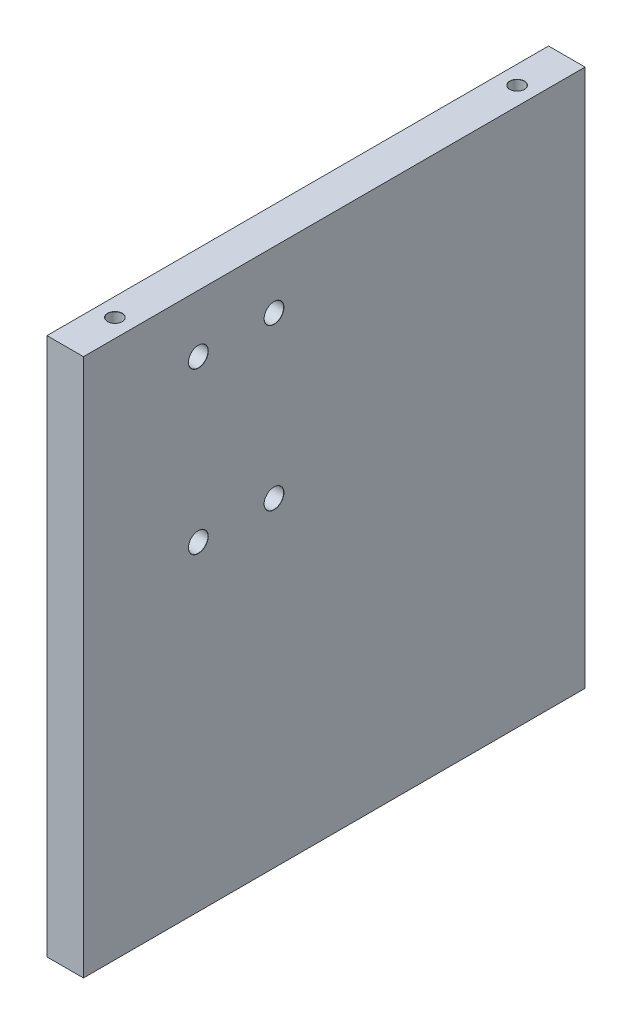
ISO-10303-21;
HEADER;
FILE_DESCRIPTION(('STEP AP214'),'2;1');
FILE_NAME('part.step','',(''),(''),'','','');
FILE_SCHEMA(('AUTOMOTIVE_DESIGN { 1 0 10303 214 1 1 1 1 }'));
ENDSEC;
DATA;
#1=APPLICATION_CONTEXT('core data for automotive mechanical design processes');
#2=APPLICATION_PROTOCOL_DEFINITION('international standard','automotive_design',2000,#1);
#3=PRODUCT_CONTEXT('',#1,'mechanical');
#4=PRODUCT('Part','Part','',(#3));
#5=PRODUCT_RELATED_PRODUCT_CATEGORY('part','',(#4));
#6=PRODUCT_DEFINITION_FORMATION('','',#4);
#7=PRODUCT_DEFINITION_CONTEXT('part definition',#1,'design');
#8=PRODUCT_DEFINITION('design','',#6,#7);
#9=PRODUCT_DEFINITION_SHAPE('','',#8);
#10=(LENGTH_UNIT() NAMED_UNIT(*) SI_UNIT(.MILLI.,.METRE.));
#11=(NAMED_UNIT(*) PLANE_ANGLE_UNIT() SI_UNIT($,.RADIAN.));
#12=(NAMED_UNIT(*) SI_UNIT($,.STERADIAN.) SOLID_ANGLE_UNIT());
#13=UNCERTAINTY_MEASURE_WITH_UNIT(LENGTH_MEASURE(1.E-05),#10,'distance_accuracy_value','');
#14=(GEOMETRIC_REPRESENTATION_CONTEXT(3) GLOBAL_UNCERTAINTY_ASSIGNED_CONTEXT((#13)) GLOBAL_UNIT_ASSIGNED_CONTEXT((#10,
#11,#12)) REPRESENTATION_CONTEXT('',''));
#15=CARTESIAN_POINT('',(0.,0.,0.));
#16=DIRECTION('',(0.,0.,1.));
#17=DIRECTION('',(1.,0.,0.));
#18=AXIS2_PLACEMENT_3D('',#15,#16,#17);
#19=CARTESIAN_POINT('',(0.,0.,0.));
#20=DIRECTION('',(-1.,0.,0.));
#21=DIRECTION('',(0.,0.,1.));
#22=AXIS2_PLACEMENT_3D('',#19,#20,#21);
#23=PLANE('',#22);
#24=CARTESIAN_POINT('',(0.,36.825,23.65));
#25=DIRECTION('',(1.,0.,0.));
#26=DIRECTION('',(0.,0.,-1.));
#27=AXIS2_PLACEMENT_3D('',#24,#25,#26);
#28=CIRCLE('',#27,1.7);
#29=CARTESIAN_POINT('',(0.,36.825,21.95));
#30=VERTEX_POINT('',#29);
#31=EDGE_CURVE('E299',#30,#30,#28,.T.);
#32=ORIENTED_EDGE('',*,*,#31,.T.);
#33=EDGE_LOOP('',(#32));
#34=FACE_BOUND('',#33,.T.);
#35=CARTESIAN_POINT('',(0.,36.825,10.48));
#36=DIRECTION('',(1.,0.,0.));
#37=DIRECTION('',(0.,0.,-1.));
#38=AXIS2_PLACEMENT_3D('',#35,#36,#37);
#39=CIRCLE('',#38,1.7);
#40=CARTESIAN_POINT('',(0.,36.825,8.78));
#41=VERTEX_POINT('',#40);
#42=EDGE_CURVE('E312',#41,#41,#39,.T.);
#43=ORIENTED_EDGE('',*,*,#42,.T.);
#44=EDGE_LOOP('',(#43));
#45=FACE_BOUND('',#44,.T.);
#46=DIRECTION('',(0.,1.,0.));
#47=VECTOR('',#46,1.);
#48=CARTESIAN_POINT('',(0.,-46.825,-43.65));
#49=LINE('',#48,#47);
#50=CARTESIAN_POINT('',(0.,-46.825,-43.65));
#51=VERTEX_POINT('',#50);
#52=CARTESIAN_POINT('',(0.,46.825,-43.65));
#53=VERTEX_POINT('',#52);
#54=EDGE_CURVE('E156',#51,#53,#49,.T.);
#55=ORIENTED_EDGE('',*,*,#54,.F.);
#56=DIRECTION('',(0.,0.,-1.));
#57=VECTOR('',#56,1.);
#58=CARTESIAN_POINT('',(0.,-46.825,43.65));
#59=LINE('',#58,#57);
#60=CARTESIAN_POINT('',(0.,-46.825,43.65));
#61=VERTEX_POINT('',#60);
#62=EDGE_CURVE('E81',#61,#51,#59,.T.);
#63=ORIENTED_EDGE('',*,*,#62,.F.);
#64=DIRECTION('',(0.,-1.,0.));
#65=VECTOR('',#64,1.);
#66=CARTESIAN_POINT('',(0.,-46.825,43.65));
#67=LINE('',#66,#65);
#68=CARTESIAN_POINT('',(0.,46.825,43.65));
#69=VERTEX_POINT('',#68);
#70=EDGE_CURVE('E75',#69,#61,#67,.T.);
#71=ORIENTED_EDGE('',*,*,#70,.F.);
#72=DIRECTION('',(0.,0.,1.));
#73=VECTOR('',#72,1.);
#74=CARTESIAN_POINT('',(0.,46.825,43.65));
#75=LINE('',#74,#73);
#76=EDGE_CURVE('E171',#53,#69,#75,.T.);
#77=ORIENTED_EDGE('',*,*,#76,.F.);
#78=EDGE_LOOP('',(#55,#63,#71,#77));
#79=FACE_BOUND('',#78,.T.);
#80=CARTESIAN_POINT('',(0.,8.885,23.65));
#81=DIRECTION('',(1.,0.,0.));
#82=DIRECTION('',(0.,0.,-1.));
#83=AXIS2_PLACEMENT_3D('',#80,#81,#82);
#84=CIRCLE('',#83,1.7);
#85=CARTESIAN_POINT('',(0.,8.885,21.95));
#86=VERTEX_POINT('',#85);
#87=EDGE_CURVE('E336',#86,#86,#84,.T.);
#88=ORIENTED_EDGE('',*,*,#87,.T.);
#89=EDGE_LOOP('',(#88));
#90=FACE_BOUND('',#89,.T.);
#91=CARTESIAN_POINT('',(0.,8.885,10.48));
#92=DIRECTION('',(1.,0.,0.));
#93=DIRECTION('',(0.,0.,-1.));
#94=AXIS2_PLACEMENT_3D('',#91,#92,#93);
#95=CIRCLE('',#94,1.7);
#96=CARTESIAN_POINT('',(0.,8.885,8.78));
#97=VERTEX_POINT('',#96);
#98=EDGE_CURVE('E324',#97,#97,#95,.T.);
#99=ORIENTED_EDGE('',*,*,#98,.T.);
#100=EDGE_LOOP('',(#99));
#101=FACE_BOUND('',#100,.T.);
#102=ADVANCED_FACE('F39',(#34,#45,#79,#90,#101),#23,.T.);
#103=CARTESIAN_POINT('',(6.35,-46.825,-43.65));
#104=DIRECTION('',(0.,0.,1.));
#105=DIRECTION('',(1.,0.,0.));
#106=AXIS2_PLACEMENT_3D('',#103,#104,#105);
#107=PLANE('',#106);
#108=ORIENTED_EDGE('',*,*,#54,.T.);
#109=DIRECTION('',(-1.,0.,0.));
#110=VECTOR('',#109,1.);
#111=CARTESIAN_POINT('',(6.35,46.825,-43.65));
#112=LINE('',#111,#110);
#113=CARTESIAN_POINT('',(6.35,46.825,-43.65));
#114=VERTEX_POINT('',#113);
#115=EDGE_CURVE('E11',#114,#53,#112,.T.);
#116=ORIENTED_EDGE('',*,*,#115,.F.);
#117=DIRECTION('',(0.,1.,0.));
#118=VECTOR('',#117,1.);
#119=CARTESIAN_POINT('',(6.35,-46.825,-43.65));
#120=LINE('',#119,#118);
#121=CARTESIAN_POINT('',(6.35,-46.825,-43.65));
#122=VERTEX_POINT('',#121);
#123=EDGE_CURVE('E157',#122,#114,#120,.T.);
#124=ORIENTED_EDGE('',*,*,#123,.F.);
#125=DIRECTION('',(-1.,0.,0.));
#126=VECTOR('',#125,1.);
#127=CARTESIAN_POINT('',(6.35,-46.825,-43.65));
#128=LINE('',#127,#126);
#129=EDGE_CURVE('E167',#122,#51,#128,.T.);
#130=ORIENTED_EDGE('',*,*,#129,.T.);
#131=EDGE_LOOP('',(#108,#116,#124,#130));
#132=FACE_BOUND('',#131,.T.);
#133=ADVANCED_FACE('F41',(#132),#107,.F.);
#134=CARTESIAN_POINT('',(6.35,46.825,43.65));
#135=DIRECTION('',(0.,-1.,0.));
#136=DIRECTION('',(0.,0.,-1.));
#137=AXIS2_PLACEMENT_3D('',#134,#135,#136);
#138=PLANE('',#137);
#139=CARTESIAN_POINT('',(3.175,46.825,-35.));
#140=DIRECTION('',(0.,1.,0.));
#141=DIRECTION('',(0.,0.,1.));
#142=AXIS2_PLACEMENT_3D('',#139,#140,#141);
#143=CIRCLE('',#142,1.275);
#144=CARTESIAN_POINT('',(3.175,46.825,-33.725));
#145=VERTEX_POINT('',#144);
#146=EDGE_CURVE('E132',#145,#145,#143,.T.);
#147=ORIENTED_EDGE('',*,*,#146,.F.);
#148=EDGE_LOOP('',(#147));
#149=FACE_BOUND('',#148,.T.);
#150=CARTESIAN_POINT('',(3.17500000000001,46.825,35.));
#151=DIRECTION('',(0.,1.,0.));
#152=DIRECTION('',(0.,0.,1.));
#153=AXIS2_PLACEMENT_3D('',#150,#151,#152);
#154=CIRCLE('',#153,1.275);
#155=CARTESIAN_POINT('',(3.17500000000001,46.825,36.275));
#156=VERTEX_POINT('',#155);
#157=EDGE_CURVE('E144',#156,#156,#154,.T.);
#158=ORIENTED_EDGE('',*,*,#157,.F.);
#159=EDGE_LOOP('',(#158));
#160=FACE_BOUND('',#159,.T.);
#161=ORIENTED_EDGE('',*,*,#76,.T.);
#162=DIRECTION('',(-1.,0.,0.));
#163=VECTOR('',#162,1.);
#164=CARTESIAN_POINT('',(6.35,46.825,43.65));
#165=LINE('',#164,#163);
#166=CARTESIAN_POINT('',(6.35,46.825,43.65));
#167=VERTEX_POINT('',#166);
#168=EDGE_CURVE('E49',#167,#69,#165,.T.);
#169=ORIENTED_EDGE('',*,*,#168,.F.);
#170=DIRECTION('',(0.,0.,1.));
#171=VECTOR('',#170,1.);
#172=CARTESIAN_POINT('',(6.35,46.825,43.65));
#173=LINE('',#172,#171);
#174=EDGE_CURVE('E88',#114,#167,#173,.T.);
#175=ORIENTED_EDGE('',*,*,#174,.F.);
#176=ORIENTED_EDGE('',*,*,#115,.T.);
#177=EDGE_LOOP('',(#161,#169,#175,#176));
#178=FACE_BOUND('',#177,.T.);
#179=ADVANCED_FACE('F203',(#149,#160,#178),#138,.F.);
#180=CARTESIAN_POINT('',(6.35,-46.825,43.65));
#181=DIRECTION('',(0.,0.,-1.));
#182=DIRECTION('',(-1.,0.,0.));
#183=AXIS2_PLACEMENT_3D('',#180,#181,#182);
#184=PLANE('',#183);
#185=ORIENTED_EDGE('',*,*,#70,.T.);
#186=DIRECTION('',(-1.,0.,0.));
#187=VECTOR('',#186,1.);
#188=CARTESIAN_POINT('',(6.35,-46.825,43.65));
#189=LINE('',#188,#187);
#190=CARTESIAN_POINT('',(6.35,-46.825,43.65));
#191=VERTEX_POINT('',#190);
#192=EDGE_CURVE('E180',#191,#61,#189,.T.);
#193=ORIENTED_EDGE('',*,*,#192,.F.);
#194=DIRECTION('',(0.,-1.,0.));
#195=VECTOR('',#194,1.);
#196=CARTESIAN_POINT('',(6.35,-46.825,43.65));
#197=LINE('',#196,#195);
#198=EDGE_CURVE('E162',#167,#191,#197,.T.);
#199=ORIENTED_EDGE('',*,*,#198,.F.);
#200=ORIENTED_EDGE('',*,*,#168,.T.);
#201=EDGE_LOOP('',(#185,#193,#199,#200));
#202=FACE_BOUND('',#201,.T.);
#203=ADVANCED_FACE('F184',(#202),#184,.F.);
#204=CARTESIAN_POINT('',(6.35,-46.825,43.65));
#205=DIRECTION('',(0.,1.,0.));
#206=DIRECTION('',(0.,0.,1.));
#207=AXIS2_PLACEMENT_3D('',#204,#205,#206);
#208=PLANE('',#207);
#209=CARTESIAN_POINT('',(3.17500000000001,-46.825,35.));
#210=DIRECTION('',(0.,-1.,0.));
#211=DIRECTION('',(0.,0.,-1.));
#212=AXIS2_PLACEMENT_3D('',#209,#210,#211);
#213=CIRCLE('',#212,1.275);
#214=CARTESIAN_POINT('',(3.17500000000001,-46.825,33.725));
#215=VERTEX_POINT('',#214);
#216=EDGE_CURVE('E121',#215,#215,#213,.T.);
#217=ORIENTED_EDGE('',*,*,#216,.F.);
#218=EDGE_LOOP('',(#217));
#219=FACE_BOUND('',#218,.T.);
#220=CARTESIAN_POINT('',(3.175,-46.825,-35.));
#221=DIRECTION('',(0.,-1.,0.));
#222=DIRECTION('',(0.,0.,-1.));
#223=AXIS2_PLACEMENT_3D('',#220,#221,#222);
#224=CIRCLE('',#223,1.275);
#225=CARTESIAN_POINT('',(3.175,-46.825,-36.275));
#226=VERTEX_POINT('',#225);
#227=EDGE_CURVE('E112',#226,#226,#224,.T.);
#228=ORIENTED_EDGE('',*,*,#227,.F.);
#229=EDGE_LOOP('',(#228));
#230=FACE_BOUND('',#229,.T.);
#231=ORIENTED_EDGE('',*,*,#62,.T.);
#232=ORIENTED_EDGE('',*,*,#129,.F.);
#233=DIRECTION('',(0.,0.,-1.));
#234=VECTOR('',#233,1.);
#235=CARTESIAN_POINT('',(6.35,-46.825,43.65));
#236=LINE('',#235,#234);
#237=EDGE_CURVE('E57',#191,#122,#236,.T.);
#238=ORIENTED_EDGE('',*,*,#237,.F.);
#239=ORIENTED_EDGE('',*,*,#192,.T.);
#240=EDGE_LOOP('',(#231,#232,#238,#239));
#241=FACE_BOUND('',#240,.T.);
#242=ADVANCED_FACE('F191',(#219,#230,#241),#208,.F.);
#243=CARTESIAN_POINT('',(6.35,0.,0.));
#244=DIRECTION('',(-1.,0.,0.));
#245=DIRECTION('',(0.,0.,1.));
#246=AXIS2_PLACEMENT_3D('',#243,#244,#245);
#247=PLANE('',#246);
#248=CARTESIAN_POINT('',(6.35,36.825,23.65));
#249=DIRECTION('',(1.,0.,0.));
#250=DIRECTION('',(0.,0.,-1.));
#251=AXIS2_PLACEMENT_3D('',#248,#249,#250);
#252=CIRCLE('',#251,1.725);
#253=CARTESIAN_POINT('',(6.35,36.825,21.925));
#254=VERTEX_POINT('',#253);
#255=EDGE_CURVE('E295',#254,#254,#252,.T.);
#256=ORIENTED_EDGE('',*,*,#255,.F.);
#257=EDGE_LOOP('',(#256));
#258=FACE_BOUND('',#257,.T.);
#259=CARTESIAN_POINT('',(6.35,36.825,10.48));
#260=DIRECTION('',(1.,0.,0.));
#261=DIRECTION('',(0.,0.,-1.));
#262=AXIS2_PLACEMENT_3D('',#259,#260,#261);
#263=CIRCLE('',#262,1.725);
#264=CARTESIAN_POINT('',(6.35,36.825,8.755));
#265=VERTEX_POINT('',#264);
#266=EDGE_CURVE('E304',#265,#265,#263,.T.);
#267=ORIENTED_EDGE('',*,*,#266,.F.);
#268=EDGE_LOOP('',(#267));
#269=FACE_BOUND('',#268,.T.);
#270=CARTESIAN_POINT('',(6.35,8.885,10.48));
#271=DIRECTION('',(1.,0.,0.));
#272=DIRECTION('',(0.,0.,-1.));
#273=AXIS2_PLACEMENT_3D('',#270,#271,#272);
#274=CIRCLE('',#273,1.725);
#275=CARTESIAN_POINT('',(6.35,8.885,8.755));
#276=VERTEX_POINT('',#275);
#277=EDGE_CURVE('E316',#276,#276,#274,.T.);
#278=ORIENTED_EDGE('',*,*,#277,.F.);
#279=EDGE_LOOP('',(#278));
#280=FACE_BOUND('',#279,.T.);
#281=CARTESIAN_POINT('',(6.35,8.885,23.65));
#282=DIRECTION('',(1.,0.,0.));
#283=DIRECTION('',(0.,0.,-1.));
#284=AXIS2_PLACEMENT_3D('',#281,#282,#283);
#285=CIRCLE('',#284,1.725);
#286=CARTESIAN_POINT('',(6.35,8.885,21.925));
#287=VERTEX_POINT('',#286);
#288=EDGE_CURVE('E328',#287,#287,#285,.T.);
#289=ORIENTED_EDGE('',*,*,#288,.F.);
#290=EDGE_LOOP('',(#289));
#291=FACE_BOUND('',#290,.T.);
#292=ORIENTED_EDGE('',*,*,#123,.T.);
#293=ORIENTED_EDGE('',*,*,#174,.T.);
#294=ORIENTED_EDGE('',*,*,#198,.T.);
#295=ORIENTED_EDGE('',*,*,#237,.T.);
#296=EDGE_LOOP('',(#292,#293,#294,#295));
#297=FACE_BOUND('',#296,.T.);
#298=ADVANCED_FACE('F193',(#258,#269,#280,#291,#297),#247,.F.);
#299=CARTESIAN_POINT('',(3.17500000000001,36.825,35.));
#300=DIRECTION('',(0.,1.,0.));
#301=DIRECTION('',(0.,0.,1.));
#302=AXIS2_PLACEMENT_3D('',#299,#300,#301);
#303=CONICAL_SURFACE('',#302,1.24999999999999,1.02974425867665);
#304=CARTESIAN_POINT('',(3.17500000000001,36.0739242262155,35.));
#305=VERTEX_POINT('',#304);
#306=VERTEX_LOOP('',#305);
#307=FACE_BOUND('',#306,.T.);
#308=CARTESIAN_POINT('',(3.17500000000001,36.825,35.));
#309=DIRECTION('',(0.,1.,0.));
#310=DIRECTION('',(0.,0.,1.));
#311=AXIS2_PLACEMENT_3D('',#308,#309,#310);
#312=CIRCLE('',#311,1.24999999999999);
#313=CARTESIAN_POINT('',(3.17500000000001,36.825,36.25));
#314=VERTEX_POINT('',#313);
#315=EDGE_CURVE('E152',#314,#314,#312,.T.);
#316=ORIENTED_EDGE('',*,*,#315,.T.);
#317=EDGE_LOOP('',(#316));
#318=FACE_BOUND('',#317,.T.);
#319=ADVANCED_FACE('F200',(#307,#318),#303,.F.);
#320=CARTESIAN_POINT('',(3.17500000000001,46.825,35.));
#321=DIRECTION('',(0.,1.,0.));
#322=DIRECTION('',(0.,0.,1.));
#323=AXIS2_PLACEMENT_3D('',#320,#321,#322);
#324=CYLINDRICAL_SURFACE('',#323,1.24999999999999);
#325=ORIENTED_EDGE('',*,*,#315,.F.);
#326=EDGE_LOOP('',(#325));
#327=FACE_BOUND('',#326,.T.);
#328=CARTESIAN_POINT('',(3.17500000000001,46.8,35.));
#329=DIRECTION('',(0.,1.,0.));
#330=DIRECTION('',(0.,0.,1.));
#331=AXIS2_PLACEMENT_3D('',#328,#329,#330);
#332=CIRCLE('',#331,1.24999999999999);
#333=CARTESIAN_POINT('',(3.17500000000001,46.8,36.25));
#334=VERTEX_POINT('',#333);
#335=EDGE_CURVE('E148',#334,#334,#332,.T.);
#336=ORIENTED_EDGE('',*,*,#335,.T.);
#337=EDGE_LOOP('',(#336));
#338=FACE_BOUND('',#337,.T.);
#339=ADVANCED_FACE('F218',(#327,#338),#324,.F.);
#340=CARTESIAN_POINT('',(3.17500000000001,46.825,35.));
#341=DIRECTION('',(0.,1.,0.));
#342=DIRECTION('',(0.,0.,1.));
#343=AXIS2_PLACEMENT_3D('',#340,#341,#342);
#344=CONICAL_SURFACE('',#343,1.275,0.785398163398003);
#345=ORIENTED_EDGE('',*,*,#335,.F.);
#346=EDGE_LOOP('',(#345));
#347=FACE_BOUND('',#346,.T.);
#348=ORIENTED_EDGE('',*,*,#157,.T.);
#349=EDGE_LOOP('',(#348));
#350=FACE_BOUND('',#349,.T.);
#351=ADVANCED_FACE('F222',(#347,#350),#344,.F.);
#352=CARTESIAN_POINT('',(3.175,36.825,-35.));
#353=DIRECTION('',(0.,1.,0.));
#354=DIRECTION('',(0.,0.,1.));
#355=AXIS2_PLACEMENT_3D('',#352,#353,#354);
#356=CONICAL_SURFACE('',#355,1.24999999999999,1.02974425867665);
#357=CARTESIAN_POINT('',(3.175,36.0739242262155,-35.));
#358=VERTEX_POINT('',#357);
#359=VERTEX_LOOP('',#358);
#360=FACE_BOUND('',#359,.T.);
#361=CARTESIAN_POINT('',(3.175,36.825,-35.));
#362=DIRECTION('',(0.,1.,0.));
#363=DIRECTION('',(0.,0.,1.));
#364=AXIS2_PLACEMENT_3D('',#361,#362,#363);
#365=CIRCLE('',#364,1.24999999999999);
#366=CARTESIAN_POINT('',(3.175,36.825,-33.75));
#367=VERTEX_POINT('',#366);
#368=EDGE_CURVE('E140',#367,#367,#365,.T.);
#369=ORIENTED_EDGE('',*,*,#368,.T.);
#370=EDGE_LOOP('',(#369));
#371=FACE_BOUND('',#370,.T.);
#372=ADVANCED_FACE('F226',(#360,#371),#356,.F.);
#373=CARTESIAN_POINT('',(3.175,46.825,-35.));
#374=DIRECTION('',(0.,1.,0.));
#375=DIRECTION('',(0.,0.,1.));
#376=AXIS2_PLACEMENT_3D('',#373,#374,#375);
#377=CYLINDRICAL_SURFACE('',#376,1.24999999999999);
#378=ORIENTED_EDGE('',*,*,#368,.F.);
#379=EDGE_LOOP('',(#378));
#380=FACE_BOUND('',#379,.T.);
#381=CARTESIAN_POINT('',(3.175,46.8,-35.));
#382=DIRECTION('',(0.,1.,0.));
#383=DIRECTION('',(0.,0.,1.));
#384=AXIS2_PLACEMENT_3D('',#381,#382,#383);
#385=CIRCLE('',#384,1.24999999999999);
#386=CARTESIAN_POINT('',(3.175,46.8,-33.75));
#387=VERTEX_POINT('',#386);
#388=EDGE_CURVE('E136',#387,#387,#385,.T.);
#389=ORIENTED_EDGE('',*,*,#388,.T.);
#390=EDGE_LOOP('',(#389));
#391=FACE_BOUND('',#390,.T.);
#392=ADVANCED_FACE('F230',(#380,#391),#377,.F.);
#393=CARTESIAN_POINT('',(3.175,46.825,-35.));
#394=DIRECTION('',(0.,1.,0.));
#395=DIRECTION('',(0.,0.,1.));
#396=AXIS2_PLACEMENT_3D('',#393,#394,#395);
#397=CONICAL_SURFACE('',#396,1.275,0.785398163398003);
#398=ORIENTED_EDGE('',*,*,#388,.F.);
#399=EDGE_LOOP('',(#398));
#400=FACE_BOUND('',#399,.T.);
#401=ORIENTED_EDGE('',*,*,#146,.T.);
#402=EDGE_LOOP('',(#401));
#403=FACE_BOUND('',#402,.T.);
#404=ADVANCED_FACE('F234',(#400,#403),#397,.F.);
#405=CARTESIAN_POINT('',(3.175,-37.5760757737845,-35.));
#406=DIRECTION('',(0.,-1.,0.));
#407=DIRECTION('',(0.,0.,-1.));
#408=AXIS2_PLACEMENT_3D('',#405,#406,#407);
#409=CONICAL_SURFACE('',#408,1.25,1.02974425867665);
#410=CARTESIAN_POINT('',(3.175,-36.825,-35.));
#411=VERTEX_POINT('',#410);
#412=VERTEX_LOOP('',#411);
#413=FACE_BOUND('',#412,.T.);
#414=CARTESIAN_POINT('',(3.175,-37.5760757737845,-35.));
#415=DIRECTION('',(0.,-1.,0.));
#416=DIRECTION('',(0.,0.,-1.));
#417=AXIS2_PLACEMENT_3D('',#414,#415,#416);
#418=CIRCLE('',#417,1.25);
#419=CARTESIAN_POINT('',(3.175,-37.5760757737845,-36.25));
#420=VERTEX_POINT('',#419);
#421=EDGE_CURVE('E128',#420,#420,#418,.T.);
#422=ORIENTED_EDGE('',*,*,#421,.T.);
#423=EDGE_LOOP('',(#422));
#424=FACE_BOUND('',#423,.T.);
#425=ADVANCED_FACE('F238',(#413,#424),#409,.F.);
#426=CARTESIAN_POINT('',(3.175,-46.825,-35.));
#427=DIRECTION('',(0.,-1.,0.));
#428=DIRECTION('',(0.,0.,-1.));
#429=AXIS2_PLACEMENT_3D('',#426,#427,#428);
#430=CYLINDRICAL_SURFACE('',#429,1.24999999999999);
#431=ORIENTED_EDGE('',*,*,#421,.F.);
#432=EDGE_LOOP('',(#431));
#433=FACE_BOUND('',#432,.T.);
#434=CARTESIAN_POINT('',(3.175,-46.8,-35.));
#435=DIRECTION('',(0.,-1.,0.));
#436=DIRECTION('',(0.,0.,-1.));
#437=AXIS2_PLACEMENT_3D('',#434,#435,#436);
#438=CIRCLE('',#437,1.24999999999999);
#439=CARTESIAN_POINT('',(3.175,-46.8,-36.25));
#440=VERTEX_POINT('',#439);
#441=EDGE_CURVE('E118',#440,#440,#438,.T.);
#442=ORIENTED_EDGE('',*,*,#441,.T.);
#443=EDGE_LOOP('',(#442));
#444=FACE_BOUND('',#443,.T.);
#445=ADVANCED_FACE('F242',(#433,#444),#430,.F.);
#446=CARTESIAN_POINT('',(3.175,-46.825,-35.));
#447=DIRECTION('',(0.,-1.,0.));
#448=DIRECTION('',(0.,0.,-1.));
#449=AXIS2_PLACEMENT_3D('',#446,#447,#448);
#450=CONICAL_SURFACE('',#449,1.275,0.785398163398003);
#451=ORIENTED_EDGE('',*,*,#441,.F.);
#452=EDGE_LOOP('',(#451));
#453=FACE_BOUND('',#452,.T.);
#454=ORIENTED_EDGE('',*,*,#227,.T.);
#455=EDGE_LOOP('',(#454));
#456=FACE_BOUND('',#455,.T.);
#457=ADVANCED_FACE('F105',(#453,#456),#450,.F.);
#458=CARTESIAN_POINT('',(3.17500000000001,-37.5760757737845,35.));
#459=DIRECTION('',(0.,-1.,0.));
#460=DIRECTION('',(0.,0.,-1.));
#461=AXIS2_PLACEMENT_3D('',#458,#459,#460);
#462=CONICAL_SURFACE('',#461,1.25,1.02974425867665);
#463=CARTESIAN_POINT('',(3.17500000000001,-36.825,35.));
#464=VERTEX_POINT('',#463);
#465=VERTEX_LOOP('',#464);
#466=FACE_BOUND('',#465,.T.);
#467=CARTESIAN_POINT('',(3.17500000000001,-37.5760757737845,35.));
#468=DIRECTION('',(0.,-1.,0.));
#469=DIRECTION('',(0.,0.,-1.));
#470=AXIS2_PLACEMENT_3D('',#467,#468,#469);
#471=CIRCLE('',#470,1.25);
#472=CARTESIAN_POINT('',(3.17500000000001,-37.5760757737845,33.75));
#473=VERTEX_POINT('',#472);
#474=EDGE_CURVE('E109',#473,#473,#471,.T.);
#475=ORIENTED_EDGE('',*,*,#474,.T.);
#476=EDGE_LOOP('',(#475));
#477=FACE_BOUND('',#476,.T.);
#478=ADVANCED_FACE('F101',(#466,#477),#462,.F.);
#479=CARTESIAN_POINT('',(3.17500000000001,-46.825,35.));
#480=DIRECTION('',(0.,-1.,0.));
#481=DIRECTION('',(0.,0.,-1.));
#482=AXIS2_PLACEMENT_3D('',#479,#480,#481);
#483=CYLINDRICAL_SURFACE('',#482,1.24999999999999);
#484=ORIENTED_EDGE('',*,*,#474,.F.);
#485=EDGE_LOOP('',(#484));
#486=FACE_BOUND('',#485,.T.);
#487=CARTESIAN_POINT('',(3.17500000000001,-46.8,35.));
#488=DIRECTION('',(0.,-1.,0.));
#489=DIRECTION('',(0.,0.,-1.));
#490=AXIS2_PLACEMENT_3D('',#487,#488,#489);
#491=CIRCLE('',#490,1.24999999999999);
#492=CARTESIAN_POINT('',(3.17500000000001,-46.8,33.75));
#493=VERTEX_POINT('',#492);
#494=EDGE_CURVE('E113',#493,#493,#491,.T.);
#495=ORIENTED_EDGE('',*,*,#494,.T.);
#496=EDGE_LOOP('',(#495));
#497=FACE_BOUND('',#496,.T.);
#498=ADVANCED_FACE('F104',(#486,#497),#483,.F.);
#499=CARTESIAN_POINT('',(3.17500000000001,-46.825,35.));
#500=DIRECTION('',(0.,-1.,0.));
#501=DIRECTION('',(0.,0.,-1.));
#502=AXIS2_PLACEMENT_3D('',#499,#500,#501);
#503=CONICAL_SURFACE('',#502,1.275,0.785398163398003);
#504=ORIENTED_EDGE('',*,*,#494,.F.);
#505=EDGE_LOOP('',(#504));
#506=FACE_BOUND('',#505,.T.);
#507=ORIENTED_EDGE('',*,*,#216,.T.);
#508=EDGE_LOOP('',(#507));
#509=FACE_BOUND('',#508,.T.);
#510=ADVANCED_FACE('F252',(#506,#509),#503,.F.);
#511=CARTESIAN_POINT('',(6.35,8.885,23.65));
#512=DIRECTION('',(1.,0.,0.));
#513=DIRECTION('',(0.,0.,-1.));
#514=AXIS2_PLACEMENT_3D('',#511,#512,#513);
#515=CYLINDRICAL_SURFACE('',#514,1.69999999999999);
#516=ORIENTED_EDGE('',*,*,#87,.F.);
#517=EDGE_LOOP('',(#516));
#518=FACE_BOUND('',#517,.T.);
#519=CARTESIAN_POINT('',(6.32499999999997,8.885,23.65));
#520=DIRECTION('',(1.,0.,0.));
#521=DIRECTION('',(0.,0.,-1.));
#522=AXIS2_PLACEMENT_3D('',#519,#520,#521);
#523=CIRCLE('',#522,1.69999999999999);
#524=CARTESIAN_POINT('',(6.32499999999997,8.885,21.95));
#525=VERTEX_POINT('',#524);
#526=EDGE_CURVE('E332',#525,#525,#523,.T.);
#527=ORIENTED_EDGE('',*,*,#526,.T.);
#528=EDGE_LOOP('',(#527));
#529=FACE_BOUND('',#528,.T.);
#530=ADVANCED_FACE('F255',(#518,#529),#515,.F.);
#531=CARTESIAN_POINT('',(6.35,8.885,23.65));
#532=DIRECTION('',(1.,0.,0.));
#533=DIRECTION('',(0.,0.,-1.));
#534=AXIS2_PLACEMENT_3D('',#531,#532,#533);
#535=CONICAL_SURFACE('',#534,1.725,0.785398163397171);
#536=ORIENTED_EDGE('',*,*,#526,.F.);
#537=EDGE_LOOP('',(#536));
#538=FACE_BOUND('',#537,.T.);
#539=ORIENTED_EDGE('',*,*,#288,.T.);
#540=EDGE_LOOP('',(#539));
#541=FACE_BOUND('',#540,.T.);
#542=ADVANCED_FACE('F259',(#538,#541),#535,.F.);
#543=CARTESIAN_POINT('',(6.35,8.885,10.48));
#544=DIRECTION('',(1.,0.,0.));
#545=DIRECTION('',(0.,0.,-1.));
#546=AXIS2_PLACEMENT_3D('',#543,#544,#545);
#547=CYLINDRICAL_SURFACE('',#546,1.69999999999999);
#548=ORIENTED_EDGE('',*,*,#98,.F.);
#549=EDGE_LOOP('',(#548));
#550=FACE_BOUND('',#549,.T.);
#551=CARTESIAN_POINT('',(6.32499999999997,8.885,10.48));
#552=DIRECTION('',(1.,0.,0.));
#553=DIRECTION('',(0.,0.,-1.));
#554=AXIS2_PLACEMENT_3D('',#551,#552,#553);
#555=CIRCLE('',#554,1.69999999999999);
#556=CARTESIAN_POINT('',(6.32499999999997,8.885,8.78000000000001));
#557=VERTEX_POINT('',#556);
#558=EDGE_CURVE('E320',#557,#557,#555,.T.);
#559=ORIENTED_EDGE('',*,*,#558,.T.);
#560=EDGE_LOOP('',(#559));
#561=FACE_BOUND('',#560,.T.);
#562=ADVANCED_FACE('F263',(#550,#561),#547,.F.);
#563=CARTESIAN_POINT('',(6.35,8.885,10.48));
#564=DIRECTION('',(1.,0.,0.));
#565=DIRECTION('',(0.,0.,-1.));
#566=AXIS2_PLACEMENT_3D('',#563,#564,#565);
#567=CONICAL_SURFACE('',#566,1.725,0.785398163397171);
#568=ORIENTED_EDGE('',*,*,#558,.F.);
#569=EDGE_LOOP('',(#568));
#570=FACE_BOUND('',#569,.T.);
#571=ORIENTED_EDGE('',*,*,#277,.T.);
#572=EDGE_LOOP('',(#571));
#573=FACE_BOUND('',#572,.T.);
#574=ADVANCED_FACE('F267',(#570,#573),#567,.F.);
#575=CARTESIAN_POINT('',(6.35,36.825,10.48));
#576=DIRECTION('',(1.,0.,0.));
#577=DIRECTION('',(0.,0.,-1.));
#578=AXIS2_PLACEMENT_3D('',#575,#576,#577);
#579=CYLINDRICAL_SURFACE('',#578,1.69999999999999);
#580=ORIENTED_EDGE('',*,*,#42,.F.);
#581=EDGE_LOOP('',(#580));
#582=FACE_BOUND('',#581,.T.);
#583=CARTESIAN_POINT('',(6.32499999999997,36.825,10.48));
#584=DIRECTION('',(1.,0.,0.));
#585=DIRECTION('',(0.,0.,-1.));
#586=AXIS2_PLACEMENT_3D('',#583,#584,#585);
#587=CIRCLE('',#586,1.69999999999999);
#588=CARTESIAN_POINT('',(6.32499999999997,36.825,8.78000000000001));
#589=VERTEX_POINT('',#588);
#590=EDGE_CURVE('E308',#589,#589,#587,.T.);
#591=ORIENTED_EDGE('',*,*,#590,.T.);
#592=EDGE_LOOP('',(#591));
#593=FACE_BOUND('',#592,.T.);
#594=ADVANCED_FACE('F271',(#582,#593),#579,.F.);
#595=CARTESIAN_POINT('',(6.35,36.825,10.48));
#596=DIRECTION('',(1.,0.,0.));
#597=DIRECTION('',(0.,0.,-1.));
#598=AXIS2_PLACEMENT_3D('',#595,#596,#597);
#599=CONICAL_SURFACE('',#598,1.725,0.785398163397275);
#600=ORIENTED_EDGE('',*,*,#590,.F.);
#601=EDGE_LOOP('',(#600));
#602=FACE_BOUND('',#601,.T.);
#603=ORIENTED_EDGE('',*,*,#266,.T.);
#604=EDGE_LOOP('',(#603));
#605=FACE_BOUND('',#604,.T.);
#606=ADVANCED_FACE('F275',(#602,#605),#599,.F.);
#607=CARTESIAN_POINT('',(6.35,36.825,23.65));
#608=DIRECTION('',(1.,0.,0.));
#609=DIRECTION('',(0.,0.,-1.));
#610=AXIS2_PLACEMENT_3D('',#607,#608,#609);
#611=CYLINDRICAL_SURFACE('',#610,1.69999999999999);
#612=ORIENTED_EDGE('',*,*,#31,.F.);
#613=EDGE_LOOP('',(#612));
#614=FACE_BOUND('',#613,.T.);
#615=CARTESIAN_POINT('',(6.32499999999997,36.825,23.65));
#616=DIRECTION('',(1.,0.,0.));
#617=DIRECTION('',(0.,0.,-1.));
#618=AXIS2_PLACEMENT_3D('',#615,#616,#617);
#619=CIRCLE('',#618,1.69999999999999);
#620=CARTESIAN_POINT('',(6.32499999999997,36.825,21.95));
#621=VERTEX_POINT('',#620);
#622=EDGE_CURVE('E292',#621,#621,#619,.T.);
#623=ORIENTED_EDGE('',*,*,#622,.T.);
#624=EDGE_LOOP('',(#623));
#625=FACE_BOUND('',#624,.T.);
#626=ADVANCED_FACE('F279',(#614,#625),#611,.F.);
#627=CARTESIAN_POINT('',(6.35,36.825,23.65));
#628=DIRECTION('',(1.,0.,0.));
#629=DIRECTION('',(0.,0.,-1.));
#630=AXIS2_PLACEMENT_3D('',#627,#628,#629);
#631=CONICAL_SURFACE('',#630,1.725,0.785398163397275);
#632=ORIENTED_EDGE('',*,*,#622,.F.);
#633=EDGE_LOOP('',(#632));
#634=FACE_BOUND('',#633,.T.);
#635=ORIENTED_EDGE('',*,*,#255,.T.);
#636=EDGE_LOOP('',(#635));
#637=FACE_BOUND('',#636,.T.);
#638=ADVANCED_FACE('F283',(#634,#637),#631,.F.);
#639=CLOSED_SHELL('',(#102,#133,#179,#203,#242,#298,#319,#339,#351,#372,#392,#404,#425,#445,
#457,#478,#498,#510,#530,#542,#562,#574,#594,#606,#626,#638));
#640=MANIFOLD_SOLID_BREP('B2',#639);
#641=ADVANCED_BREP_SHAPE_REPRESENTATION('',(#18,#640),#14);
#642=SHAPE_DEFINITION_REPRESENTATION(#9,#641);
ENDSEC;
END-ISO-10303-21;
